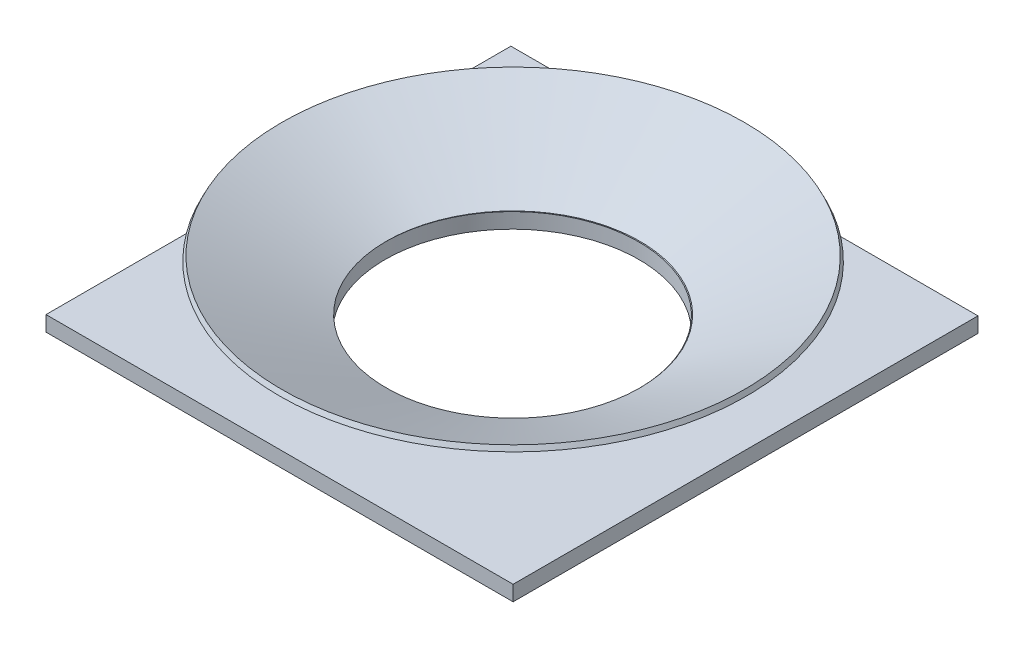
ISO-10303-21;
HEADER;
FILE_DESCRIPTION(('STEP AP214'),'2;1');
FILE_NAME('part.step','',(''),(''),'','','');
FILE_SCHEMA(('AUTOMOTIVE_DESIGN { 1 0 10303 214 1 1 1 1 }'));
ENDSEC;
DATA;
#1=APPLICATION_CONTEXT('core data for automotive mechanical design processes');
#2=APPLICATION_PROTOCOL_DEFINITION('international standard','automotive_design',2000,#1);
#3=PRODUCT_CONTEXT('',#1,'mechanical');
#4=PRODUCT('Part','Part','',(#3));
#5=PRODUCT_RELATED_PRODUCT_CATEGORY('part','',(#4));
#6=PRODUCT_DEFINITION_FORMATION('','',#4);
#7=PRODUCT_DEFINITION_CONTEXT('part definition',#1,'design');
#8=PRODUCT_DEFINITION('design','',#6,#7);
#9=PRODUCT_DEFINITION_SHAPE('','',#8);
#10=(LENGTH_UNIT() NAMED_UNIT(*) SI_UNIT(.MILLI.,.METRE.));
#11=(NAMED_UNIT(*) PLANE_ANGLE_UNIT() SI_UNIT($,.RADIAN.));
#12=(NAMED_UNIT(*) SI_UNIT($,.STERADIAN.) SOLID_ANGLE_UNIT());
#13=UNCERTAINTY_MEASURE_WITH_UNIT(LENGTH_MEASURE(1.E-05),#10,'distance_accuracy_value','');
#14=(GEOMETRIC_REPRESENTATION_CONTEXT(3) GLOBAL_UNCERTAINTY_ASSIGNED_CONTEXT((#13)) GLOBAL_UNIT_ASSIGNED_CONTEXT((#10,
#11,#12)) REPRESENTATION_CONTEXT('',''));
#15=CARTESIAN_POINT('',(0.,0.,0.));
#16=DIRECTION('',(0.,0.,1.));
#17=DIRECTION('',(1.,0.,0.));
#18=AXIS2_PLACEMENT_3D('',#15,#16,#17);
#19=CARTESIAN_POINT('',(-27.2865319598951,0.,0.));
#20=DIRECTION('',(0.,1.,0.));
#21=DIRECTION('',(0.,0.,1.));
#22=AXIS2_PLACEMENT_3D('',#19,#20,#21);
#23=PLANE('',#22);
#24=CARTESIAN_POINT('',(0.,0.,0.218671774009652));
#25=DIRECTION('',(0.,1.,0.));
#26=DIRECTION('',(0.,0.,1.));
#27=AXIS2_PLACEMENT_3D('',#24,#25,#26);
#28=CIRCLE('',#27,25.);
#29=CARTESIAN_POINT('',(-24.999760912133,0.,0.109335887005808));
#30=VERTEX_POINT('',#29);
#31=CARTESIAN_POINT('',(24.999760912133,0.,0.109335887004033));
#32=VERTEX_POINT('',#31);
#33=EDGE_CURVE('E142',#30,#32,#28,.T.);
#34=ORIENTED_EDGE('',*,*,#33,.F.);
#35=CARTESIAN_POINT('',(0.,0.,0.));
#36=DIRECTION('',(0.,-1.,0.));
#37=DIRECTION('',(0.,0.,-1.));
#38=AXIS2_PLACEMENT_3D('',#35,#36,#37);
#39=CIRCLE('',#38,25.);
#40=EDGE_CURVE('E11',#32,#30,#39,.T.);
#41=ORIENTED_EDGE('',*,*,#40,.F.);
#42=EDGE_LOOP('',(#34,#41));
#43=FACE_BOUND('',#42,.T.);
#44=ADVANCED_FACE('F33',(#43),#23,.F.);
#45=CARTESIAN_POINT('',(0.,0.,0.));
#46=DIRECTION('',(0.,1.,0.));
#47=DIRECTION('',(0.,0.,1.));
#48=AXIS2_PLACEMENT_3D('',#45,#46,#47);
#49=CONICAL_SURFACE('',#48,25.,1.11815371131727);
#50=CARTESIAN_POINT('',(0.,10.,0.));
#51=DIRECTION('',(0.,-1.,0.));
#52=DIRECTION('',(0.,0.,-1.));
#53=AXIS2_PLACEMENT_3D('',#50,#51,#52);
#54=CIRCLE('',#53,45.5626564519807);
#55=CARTESIAN_POINT('',(0.,10.,-45.5626564519807));
#56=VERTEX_POINT('',#55);
#57=EDGE_CURVE('E40',#56,#56,#54,.T.);
#58=ORIENTED_EDGE('',*,*,#57,.F.);
#59=EDGE_LOOP('',(#58));
#60=FACE_BOUND('',#59,.T.);
#61=ORIENTED_EDGE('',*,*,#40,.T.);
#62=CARTESIAN_POINT('',(0.,0.,0.));
#63=DIRECTION('',(0.,-1.,0.));
#64=DIRECTION('',(0.,0.,-1.));
#65=AXIS2_PLACEMENT_3D('',#62,#63,#64);
#66=CIRCLE('',#65,25.);
#67=EDGE_CURVE('E50',#32,#30,#66,.F.);
#68=ORIENTED_EDGE('',*,*,#67,.F.);
#69=EDGE_LOOP('',(#61,#68));
#70=FACE_BOUND('',#69,.T.);
#71=ADVANCED_FACE('F136',(#60,#70),#49,.F.);
#72=CARTESIAN_POINT('',(0.,10.,0.));
#73=DIRECTION('',(0.,-1.,0.));
#74=DIRECTION('',(0.,0.,-1.));
#75=AXIS2_PLACEMENT_3D('',#72,#73,#74);
#76=CONICAL_SURFACE('',#75,45.5626564519807,0.452642615477632);
#77=CARTESIAN_POINT('',(0.,9.10070548705893,0.));
#78=DIRECTION('',(0.,-1.,0.));
#79=DIRECTION('',(0.,0.,-1.));
#80=AXIS2_PLACEMENT_3D('',#77,#78,#79);
#81=CIRCLE('',#80,46.);
#82=CARTESIAN_POINT('',(0.,9.10070548705893,-46.));
#83=VERTEX_POINT('',#82);
#84=EDGE_CURVE('E129',#83,#83,#81,.T.);
#85=ORIENTED_EDGE('',*,*,#84,.F.);
#86=EDGE_LOOP('',(#85));
#87=FACE_BOUND('',#86,.T.);
#88=ORIENTED_EDGE('',*,*,#57,.T.);
#89=EDGE_LOOP('',(#88));
#90=FACE_BOUND('',#89,.T.);
#91=ADVANCED_FACE('F134',(#87,#90),#76,.T.);
#92=CARTESIAN_POINT('',(0.,9.10070548705893,0.));
#93=DIRECTION('',(0.,1.,0.));
#94=DIRECTION('',(0.,0.,1.));
#95=AXIS2_PLACEMENT_3D('',#92,#93,#94);
#96=CONICAL_SURFACE('',#95,46.,1.11815371131727);
#97=CARTESIAN_POINT('',(0.,1.55577033117872,0.));
#98=DIRECTION('',(0.,-1.,0.));
#99=DIRECTION('',(0.,0.,-1.));
#100=AXIS2_PLACEMENT_3D('',#97,#98,#99);
#101=CIRCLE('',#100,30.4856090437164);
#102=CARTESIAN_POINT('',(0.,1.55577033117872,-30.4856090437164));
#103=VERTEX_POINT('',#102);
#104=EDGE_CURVE('E126',#103,#103,#101,.T.);
#105=ORIENTED_EDGE('',*,*,#104,.F.);
#106=EDGE_LOOP('',(#105));
#107=FACE_BOUND('',#106,.T.);
#108=ORIENTED_EDGE('',*,*,#84,.T.);
#109=EDGE_LOOP('',(#108));
#110=FACE_BOUND('',#109,.T.);
#111=ADVANCED_FACE('F172',(#107,#110),#96,.T.);
#112=CARTESIAN_POINT('',(0.,0.819130640655411,0.));
#113=DIRECTION('',(0.,-1.,0.));
#114=DIRECTION('',(0.,0.,-1.));
#115=AXIS2_PLACEMENT_3D('',#112,#113,#114);
#116=TOROIDAL_SURFACE('',#115,30.8438505443919,0.819130640655411);
#117=CARTESIAN_POINT('',(0.,0.,0.));
#118=DIRECTION('',(0.,-1.,0.));
#119=DIRECTION('',(0.,0.,-1.));
#120=AXIS2_PLACEMENT_3D('',#117,#118,#119);
#121=CIRCLE('',#120,30.8438505443919);
#122=CARTESIAN_POINT('',(0.,0.,-30.8438505443919));
#123=VERTEX_POINT('',#122);
#124=EDGE_CURVE('E123',#123,#123,#121,.T.);
#125=ORIENTED_EDGE('',*,*,#124,.F.);
#126=EDGE_LOOP('',(#125));
#127=FACE_BOUND('',#126,.T.);
#128=ORIENTED_EDGE('',*,*,#104,.T.);
#129=EDGE_LOOP('',(#128));
#130=FACE_BOUND('',#129,.T.);
#131=ADVANCED_FACE('F169',(#127,#130),#116,.F.);
#132=CARTESIAN_POINT('',(0.,0.,0.));
#133=DIRECTION('',(0.,-1.,0.));
#134=DIRECTION('',(0.,0.,-1.));
#135=AXIS2_PLACEMENT_3D('',#132,#133,#134);
#136=PLANE('',#135);
#137=EDGE_CURVE('E46',#32,#30,#28,.T.);
#138=ORIENTED_EDGE('',*,*,#137,.F.);
#139=ORIENTED_EDGE('',*,*,#67,.T.);
#140=EDGE_LOOP('',(#138,#139));
#141=FACE_BOUND('',#140,.T.);
#142=ADVANCED_FACE('F157',(#141),#136,.F.);
#143=CARTESIAN_POINT('',(-46.,-3.,46.));
#144=DIRECTION('',(-1.,0.,0.));
#145=DIRECTION('',(0.,0.,1.));
#146=AXIS2_PLACEMENT_3D('',#143,#144,#145);
#147=PLANE('',#146);
#148=DIRECTION('',(0.,0.,1.));
#149=VECTOR('',#148,1.);
#150=CARTESIAN_POINT('',(-46.,0.,46.));
#151=LINE('',#150,#149);
#152=CARTESIAN_POINT('',(-46.,0.,-45.5626564519807));
#153=VERTEX_POINT('',#152);
#154=CARTESIAN_POINT('',(-46.,0.,46.));
#155=VERTEX_POINT('',#154);
#156=EDGE_CURVE('E112',#153,#155,#151,.T.);
#157=ORIENTED_EDGE('',*,*,#156,.F.);
#158=DIRECTION('',(0.,1.,0.));
#159=VECTOR('',#158,1.);
#160=CARTESIAN_POINT('',(-46.,-3.,-45.5626564519807));
#161=LINE('',#160,#159);
#162=CARTESIAN_POINT('',(-46.,-3.,-45.5626564519807));
#163=VERTEX_POINT('',#162);
#164=EDGE_CURVE('E101',#163,#153,#161,.T.);
#165=ORIENTED_EDGE('',*,*,#164,.F.);
#166=DIRECTION('',(0.,0.,1.));
#167=VECTOR('',#166,1.);
#168=CARTESIAN_POINT('',(-46.,-3.,46.));
#169=LINE('',#168,#167);
#170=CARTESIAN_POINT('',(-46.,-3.,46.));
#171=VERTEX_POINT('',#170);
#172=EDGE_CURVE('E95',#163,#171,#169,.T.);
#173=ORIENTED_EDGE('',*,*,#172,.T.);
#174=DIRECTION('',(0.,1.,0.));
#175=VECTOR('',#174,1.);
#176=CARTESIAN_POINT('',(-46.,-3.,46.));
#177=LINE('',#176,#175);
#178=EDGE_CURVE('E77',#171,#155,#177,.T.);
#179=ORIENTED_EDGE('',*,*,#178,.T.);
#180=EDGE_LOOP('',(#157,#165,#173,#179));
#181=FACE_BOUND('',#180,.T.);
#182=ADVANCED_FACE('F100',(#181),#147,.T.);
#183=CARTESIAN_POINT('',(-46.,-3.,-45.5626564519807));
#184=DIRECTION('',(0.,0.,-1.));
#185=DIRECTION('',(-1.,0.,0.));
#186=AXIS2_PLACEMENT_3D('',#183,#184,#185);
#187=PLANE('',#186);
#188=DIRECTION('',(-1.,0.,0.));
#189=VECTOR('',#188,1.);
#190=CARTESIAN_POINT('',(-46.,0.,-45.5626564519807));
#191=LINE('',#190,#189);
#192=CARTESIAN_POINT('',(46.,0.,-45.5626564519807));
#193=VERTEX_POINT('',#192);
#194=EDGE_CURVE('E102',#193,#153,#191,.T.);
#195=ORIENTED_EDGE('',*,*,#194,.F.);
#196=DIRECTION('',(0.,1.,0.));
#197=VECTOR('',#196,1.);
#198=CARTESIAN_POINT('',(46.,-3.,-45.5626564519807));
#199=LINE('',#198,#197);
#200=CARTESIAN_POINT('',(46.,-3.,-45.5626564519807));
#201=VERTEX_POINT('',#200);
#202=EDGE_CURVE('E119',#201,#193,#199,.T.);
#203=ORIENTED_EDGE('',*,*,#202,.F.);
#204=DIRECTION('',(-1.,0.,0.));
#205=VECTOR('',#204,1.);
#206=CARTESIAN_POINT('',(-46.,-3.,-45.5626564519807));
#207=LINE('',#206,#205);
#208=EDGE_CURVE('E88',#201,#163,#207,.T.);
#209=ORIENTED_EDGE('',*,*,#208,.T.);
#210=ORIENTED_EDGE('',*,*,#164,.T.);
#211=EDGE_LOOP('',(#195,#203,#209,#210));
#212=FACE_BOUND('',#211,.T.);
#213=ADVANCED_FACE('F193',(#212),#187,.T.);
#214=CARTESIAN_POINT('',(46.,-3.,46.));
#215=DIRECTION('',(1.,0.,0.));
#216=DIRECTION('',(0.,0.,-1.));
#217=AXIS2_PLACEMENT_3D('',#214,#215,#216);
#218=PLANE('',#217);
#219=DIRECTION('',(0.,0.,-1.));
#220=VECTOR('',#219,1.);
#221=CARTESIAN_POINT('',(46.,0.,46.));
#222=LINE('',#221,#220);
#223=CARTESIAN_POINT('',(46.,0.,46.));
#224=VERTEX_POINT('',#223);
#225=EDGE_CURVE('E105',#224,#193,#222,.T.);
#226=ORIENTED_EDGE('',*,*,#225,.F.);
#227=DIRECTION('',(0.,1.,0.));
#228=VECTOR('',#227,1.);
#229=CARTESIAN_POINT('',(46.,-3.,46.));
#230=LINE('',#229,#228);
#231=CARTESIAN_POINT('',(46.,-3.,46.));
#232=VERTEX_POINT('',#231);
#233=EDGE_CURVE('E87',#232,#224,#230,.T.);
#234=ORIENTED_EDGE('',*,*,#233,.F.);
#235=DIRECTION('',(0.,0.,-1.));
#236=VECTOR('',#235,1.);
#237=CARTESIAN_POINT('',(46.,-3.,46.));
#238=LINE('',#237,#236);
#239=EDGE_CURVE('E98',#232,#201,#238,.T.);
#240=ORIENTED_EDGE('',*,*,#239,.T.);
#241=ORIENTED_EDGE('',*,*,#202,.T.);
#242=EDGE_LOOP('',(#226,#234,#240,#241));
#243=FACE_BOUND('',#242,.T.);
#244=ADVANCED_FACE('F201',(#243),#218,.T.);
#245=CARTESIAN_POINT('',(-46.,-3.,46.));
#246=DIRECTION('',(0.,0.,1.));
#247=DIRECTION('',(1.,0.,0.));
#248=AXIS2_PLACEMENT_3D('',#245,#246,#247);
#249=PLANE('',#248);
#250=DIRECTION('',(1.,0.,0.));
#251=VECTOR('',#250,1.);
#252=CARTESIAN_POINT('',(-46.,0.,46.));
#253=LINE('',#252,#251);
#254=EDGE_CURVE('E82',#155,#224,#253,.T.);
#255=ORIENTED_EDGE('',*,*,#254,.F.);
#256=ORIENTED_EDGE('',*,*,#178,.F.);
#257=DIRECTION('',(1.,0.,0.));
#258=VECTOR('',#257,1.);
#259=CARTESIAN_POINT('',(-46.,-3.,46.));
#260=LINE('',#259,#258);
#261=EDGE_CURVE('E80',#171,#232,#260,.T.);
#262=ORIENTED_EDGE('',*,*,#261,.T.);
#263=ORIENTED_EDGE('',*,*,#233,.T.);
#264=EDGE_LOOP('',(#255,#256,#262,#263));
#265=FACE_BOUND('',#264,.T.);
#266=ADVANCED_FACE('F79',(#265),#249,.T.);
#267=CARTESIAN_POINT('',(0.,-3.,0.));
#268=DIRECTION('',(0.,-1.,0.));
#269=DIRECTION('',(0.,0.,-1.));
#270=AXIS2_PLACEMENT_3D('',#267,#268,#269);
#271=PLANE('',#270);
#272=CARTESIAN_POINT('',(0.,-3.,0.218671774009652));
#273=DIRECTION('',(0.,1.,0.));
#274=DIRECTION('',(0.,0.,1.));
#275=AXIS2_PLACEMENT_3D('',#272,#273,#274);
#276=CIRCLE('',#275,25.);
#277=CARTESIAN_POINT('',(0.,-3.,25.2186717740097));
#278=VERTEX_POINT('',#277);
#279=EDGE_CURVE('E114',#278,#278,#276,.T.);
#280=ORIENTED_EDGE('',*,*,#279,.T.);
#281=EDGE_LOOP('',(#280));
#282=FACE_BOUND('',#281,.T.);
#283=ORIENTED_EDGE('',*,*,#172,.F.);
#284=ORIENTED_EDGE('',*,*,#208,.F.);
#285=ORIENTED_EDGE('',*,*,#239,.F.);
#286=ORIENTED_EDGE('',*,*,#261,.F.);
#287=EDGE_LOOP('',(#283,#284,#285,#286));
#288=FACE_BOUND('',#287,.T.);
#289=ADVANCED_FACE('F93',(#282,#288),#271,.T.);
#290=ORIENTED_EDGE('',*,*,#124,.T.);
#291=EDGE_LOOP('',(#290));
#292=FACE_BOUND('',#291,.T.);
#293=ORIENTED_EDGE('',*,*,#156,.T.);
#294=ORIENTED_EDGE('',*,*,#254,.T.);
#295=ORIENTED_EDGE('',*,*,#225,.T.);
#296=ORIENTED_EDGE('',*,*,#194,.T.);
#297=EDGE_LOOP('',(#293,#294,#295,#296));
#298=FACE_BOUND('',#297,.T.);
#299=ADVANCED_FACE('F150',(#292,#298),#136,.F.);
#300=CARTESIAN_POINT('',(0.,-3.,0.218671774009652));
#301=DIRECTION('',(0.,1.,0.));
#302=DIRECTION('',(0.,0.,1.));
#303=AXIS2_PLACEMENT_3D('',#300,#301,#302);
#304=CYLINDRICAL_SURFACE('',#303,25.);
#305=ORIENTED_EDGE('',*,*,#279,.F.);
#306=EDGE_LOOP('',(#305));
#307=FACE_BOUND('',#306,.T.);
#308=ORIENTED_EDGE('',*,*,#137,.T.);
#309=ORIENTED_EDGE('',*,*,#33,.T.);
#310=EDGE_LOOP('',(#308,#309));
#311=FACE_BOUND('',#310,.T.);
#312=ADVANCED_FACE('F148',(#307,#311),#304,.F.);
#313=CLOSED_SHELL('',(#44,#71,#91,#111,#131,#142,#182,#213,#244,#266,#289,#299,#312));
#314=MANIFOLD_SOLID_BREP('B2',#313);
#315=ADVANCED_BREP_SHAPE_REPRESENTATION('',(#18,#314),#14);
#316=SHAPE_DEFINITION_REPRESENTATION(#9,#315);
ENDSEC;
END-ISO-10303-21;
